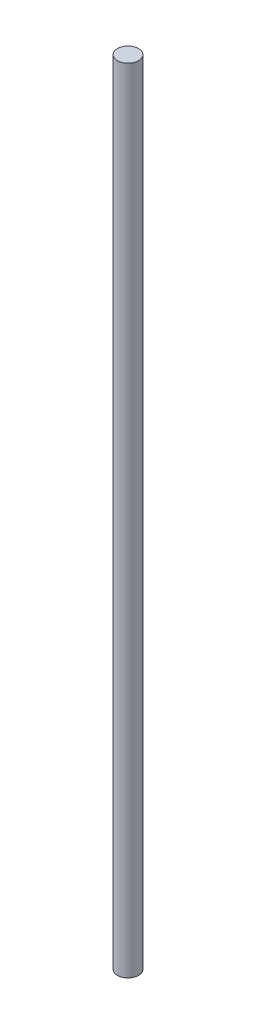
ISO-10303-21;
HEADER;
FILE_DESCRIPTION(('STEP AP214'),'2;1');
FILE_NAME('part.step','',(''),(''),'','','');
FILE_SCHEMA(('AUTOMOTIVE_DESIGN { 1 0 10303 214 1 1 1 1 }'));
ENDSEC;
DATA;
#1=APPLICATION_CONTEXT('core data for automotive mechanical design processes');
#2=APPLICATION_PROTOCOL_DEFINITION('international standard','automotive_design',2000,#1);
#3=PRODUCT_CONTEXT('',#1,'mechanical');
#4=PRODUCT('Part','Part','',(#3));
#5=PRODUCT_RELATED_PRODUCT_CATEGORY('part','',(#4));
#6=PRODUCT_DEFINITION_FORMATION('','',#4);
#7=PRODUCT_DEFINITION_CONTEXT('part definition',#1,'design');
#8=PRODUCT_DEFINITION('design','',#6,#7);
#9=PRODUCT_DEFINITION_SHAPE('','',#8);
#10=(LENGTH_UNIT() NAMED_UNIT(*) SI_UNIT(.MILLI.,.METRE.));
#11=(NAMED_UNIT(*) PLANE_ANGLE_UNIT() SI_UNIT($,.RADIAN.));
#12=(NAMED_UNIT(*) SI_UNIT($,.STERADIAN.) SOLID_ANGLE_UNIT());
#13=UNCERTAINTY_MEASURE_WITH_UNIT(LENGTH_MEASURE(1.E-05),#10,'distance_accuracy_value','');
#14=(GEOMETRIC_REPRESENTATION_CONTEXT(3) GLOBAL_UNCERTAINTY_ASSIGNED_CONTEXT((#13)) GLOBAL_UNIT_ASSIGNED_CONTEXT((#10,
#11,#12)) REPRESENTATION_CONTEXT('',''));
#15=CARTESIAN_POINT('',(0.,0.,0.));
#16=DIRECTION('',(0.,0.,1.));
#17=DIRECTION('',(1.,0.,0.));
#18=AXIS2_PLACEMENT_3D('',#15,#16,#17);
#19=CARTESIAN_POINT('',(550.,900.,-400.));
#20=DIRECTION('',(0.,-1.,0.));
#21=DIRECTION('',(0.,0.,-1.));
#22=AXIS2_PLACEMENT_3D('',#19,#20,#21);
#23=CYLINDRICAL_SURFACE('',#22,8.00000000000001);
#24=CARTESIAN_POINT('',(550.,900.,-400.));
#25=DIRECTION('',(0.,1.,0.));
#26=DIRECTION('',(0.,0.,1.));
#27=AXIS2_PLACEMENT_3D('',#24,#25,#26);
#28=CIRCLE('',#27,8.00000000000001);
#29=CARTESIAN_POINT('',(550.,900.,-392.));
#30=VERTEX_POINT('',#29);
#31=EDGE_CURVE('E10',#30,#30,#28,.T.);
#32=ORIENTED_EDGE('',*,*,#31,.F.);
#33=EDGE_LOOP('',(#32));
#34=FACE_BOUND('',#33,.T.);
#35=CARTESIAN_POINT('',(550.,300.,-400.));
#36=DIRECTION('',(0.,1.,0.));
#37=DIRECTION('',(0.,0.,1.));
#38=AXIS2_PLACEMENT_3D('',#35,#36,#37);
#39=CIRCLE('',#38,8.00000000000001);
#40=CARTESIAN_POINT('',(550.,300.,-392.));
#41=VERTEX_POINT('',#40);
#42=EDGE_CURVE('E40',#41,#41,#39,.T.);
#43=ORIENTED_EDGE('',*,*,#42,.T.);
#44=EDGE_LOOP('',(#43));
#45=FACE_BOUND('',#44,.T.);
#46=ADVANCED_FACE('F37',(#34,#45),#23,.T.);
#47=CARTESIAN_POINT('',(550.,900.,-400.));
#48=DIRECTION('',(0.,1.,0.));
#49=DIRECTION('',(0.,0.,1.));
#50=AXIS2_PLACEMENT_3D('',#47,#48,#49);
#51=PLANE('',#50);
#52=ORIENTED_EDGE('',*,*,#31,.T.);
#53=EDGE_LOOP('',(#52));
#54=FACE_BOUND('',#53,.T.);
#55=ADVANCED_FACE('F52',(#54),#51,.T.);
#56=CARTESIAN_POINT('',(550.,300.,-400.));
#57=DIRECTION('',(0.,1.,0.));
#58=DIRECTION('',(0.,0.,1.));
#59=AXIS2_PLACEMENT_3D('',#56,#57,#58);
#60=PLANE('',#59);
#61=ORIENTED_EDGE('',*,*,#42,.F.);
#62=EDGE_LOOP('',(#61));
#63=FACE_BOUND('',#62,.T.);
#64=ADVANCED_FACE('F50',(#63),#60,.F.);
#65=CLOSED_SHELL('',(#46,#55,#64));
#66=MANIFOLD_SOLID_BREP('B2',#65);
#67=ADVANCED_BREP_SHAPE_REPRESENTATION('',(#18,#66),#14);
#68=SHAPE_DEFINITION_REPRESENTATION(#9,#67);
ENDSEC;
END-ISO-10303-21;
